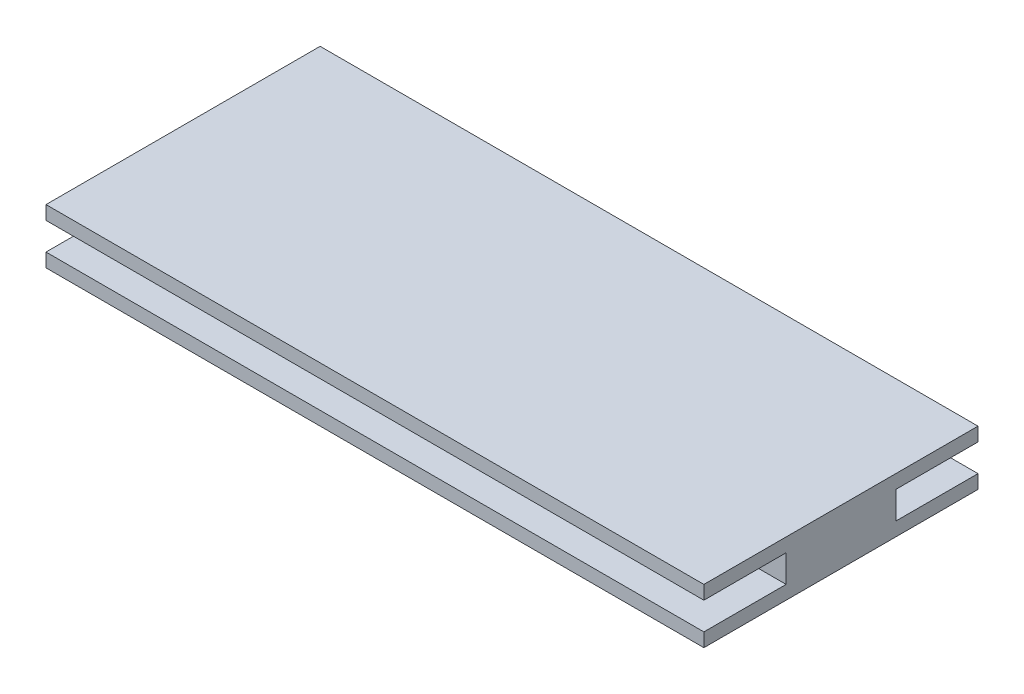
ISO-10303-21;
HEADER;
FILE_DESCRIPTION(('STEP AP214'),'2;1');
FILE_NAME('part.step','',(''),(''),'','','');
FILE_SCHEMA(('AUTOMOTIVE_DESIGN { 1 0 10303 214 1 1 1 1 }'));
ENDSEC;
DATA;
#1=APPLICATION_CONTEXT('core data for automotive mechanical design processes');
#2=APPLICATION_PROTOCOL_DEFINITION('international standard','automotive_design',2000,#1);
#3=PRODUCT_CONTEXT('',#1,'mechanical');
#4=PRODUCT('Part','Part','',(#3));
#5=PRODUCT_RELATED_PRODUCT_CATEGORY('part','',(#4));
#6=PRODUCT_DEFINITION_FORMATION('','',#4);
#7=PRODUCT_DEFINITION_CONTEXT('part definition',#1,'design');
#8=PRODUCT_DEFINITION('design','',#6,#7);
#9=PRODUCT_DEFINITION_SHAPE('','',#8);
#10=(LENGTH_UNIT() NAMED_UNIT(*) SI_UNIT(.MILLI.,.METRE.));
#11=(NAMED_UNIT(*) PLANE_ANGLE_UNIT() SI_UNIT($,.RADIAN.));
#12=(NAMED_UNIT(*) SI_UNIT($,.STERADIAN.) SOLID_ANGLE_UNIT());
#13=UNCERTAINTY_MEASURE_WITH_UNIT(LENGTH_MEASURE(1.E-05),#10,'distance_accuracy_value','');
#14=(GEOMETRIC_REPRESENTATION_CONTEXT(3) GLOBAL_UNCERTAINTY_ASSIGNED_CONTEXT((#13)) GLOBAL_UNIT_ASSIGNED_CONTEXT((#10,
#11,#12)) REPRESENTATION_CONTEXT('',''));
#15=CARTESIAN_POINT('',(0.,0.,0.));
#16=DIRECTION('',(0.,0.,1.));
#17=DIRECTION('',(1.,0.,0.));
#18=AXIS2_PLACEMENT_3D('',#15,#16,#17);
#19=CARTESIAN_POINT('',(76.2,1.5875,-15.875));
#20=DIRECTION('',(0.,0.,1.));
#21=DIRECTION('',(1.,0.,0.));
#22=AXIS2_PLACEMENT_3D('',#19,#20,#21);
#23=PLANE('',#22);
#24=DIRECTION('',(0.,1.,0.));
#25=VECTOR('',#24,1.);
#26=CARTESIAN_POINT('',(0.,1.5875,-15.875));
#27=LINE('',#26,#25);
#28=CARTESIAN_POINT('',(0.,1.5875,-15.875));
#29=VERTEX_POINT('',#28);
#30=CARTESIAN_POINT('',(0.,3.175,-15.875));
#31=VERTEX_POINT('',#30);
#32=EDGE_CURVE('E163',#29,#31,#27,.T.);
#33=ORIENTED_EDGE('',*,*,#32,.T.);
#34=DIRECTION('',(-1.,0.,0.));
#35=VECTOR('',#34,1.);
#36=CARTESIAN_POINT('',(76.2,3.175,-15.875));
#37=LINE('',#36,#35);
#38=CARTESIAN_POINT('',(76.2,3.175,-15.875));
#39=VERTEX_POINT('',#38);
#40=EDGE_CURVE('E11',#39,#31,#37,.T.);
#41=ORIENTED_EDGE('',*,*,#40,.F.);
#42=DIRECTION('',(0.,1.,0.));
#43=VECTOR('',#42,1.);
#44=CARTESIAN_POINT('',(76.2,1.5875,-15.875));
#45=LINE('',#44,#43);
#46=CARTESIAN_POINT('',(76.2,1.5875,-15.875));
#47=VERTEX_POINT('',#46);
#48=EDGE_CURVE('E185',#47,#39,#45,.T.);
#49=ORIENTED_EDGE('',*,*,#48,.F.);
#50=DIRECTION('',(-1.,0.,0.));
#51=VECTOR('',#50,1.);
#52=CARTESIAN_POINT('',(76.2,1.5875,-15.875));
#53=LINE('',#52,#51);
#54=EDGE_CURVE('E159',#47,#29,#53,.T.);
#55=ORIENTED_EDGE('',*,*,#54,.T.);
#56=EDGE_LOOP('',(#33,#41,#49,#55));
#57=FACE_BOUND('',#56,.T.);
#58=ADVANCED_FACE('F43',(#57),#23,.F.);
#59=CARTESIAN_POINT('',(76.2,3.175,15.875));
#60=DIRECTION('',(0.,-1.,0.));
#61=DIRECTION('',(0.,0.,-1.));
#62=AXIS2_PLACEMENT_3D('',#59,#60,#61);
#63=PLANE('',#62);
#64=DIRECTION('',(0.,0.,1.));
#65=VECTOR('',#64,1.);
#66=CARTESIAN_POINT('',(0.,3.175,15.875));
#67=LINE('',#66,#65);
#68=CARTESIAN_POINT('',(0.,3.175,15.875));
#69=VERTEX_POINT('',#68);
#70=EDGE_CURVE('E166',#31,#69,#67,.T.);
#71=ORIENTED_EDGE('',*,*,#70,.T.);
#72=DIRECTION('',(-1.,0.,0.));
#73=VECTOR('',#72,1.);
#74=CARTESIAN_POINT('',(76.2,3.175,15.875));
#75=LINE('',#74,#73);
#76=CARTESIAN_POINT('',(76.2,3.175,15.875));
#77=VERTEX_POINT('',#76);
#78=EDGE_CURVE('E51',#77,#69,#75,.T.);
#79=ORIENTED_EDGE('',*,*,#78,.F.);
#80=DIRECTION('',(0.,0.,1.));
#81=VECTOR('',#80,1.);
#82=CARTESIAN_POINT('',(76.2,3.175,15.875));
#83=LINE('',#82,#81);
#84=EDGE_CURVE('E114',#39,#77,#83,.T.);
#85=ORIENTED_EDGE('',*,*,#84,.F.);
#86=ORIENTED_EDGE('',*,*,#40,.T.);
#87=EDGE_LOOP('',(#71,#79,#85,#86));
#88=FACE_BOUND('',#87,.T.);
#89=ADVANCED_FACE('F263',(#88),#63,.F.);
#90=CARTESIAN_POINT('',(76.2,1.5875,15.875));
#91=DIRECTION('',(0.,0.,-1.));
#92=DIRECTION('',(-1.,0.,0.));
#93=AXIS2_PLACEMENT_3D('',#90,#91,#92);
#94=PLANE('',#93);
#95=DIRECTION('',(0.,-1.,0.));
#96=VECTOR('',#95,1.);
#97=CARTESIAN_POINT('',(0.,1.5875,15.875));
#98=LINE('',#97,#96);
#99=CARTESIAN_POINT('',(0.,1.5875,15.875));
#100=VERTEX_POINT('',#99);
#101=EDGE_CURVE('E168',#69,#100,#98,.T.);
#102=ORIENTED_EDGE('',*,*,#101,.T.);
#103=DIRECTION('',(-1.,0.,0.));
#104=VECTOR('',#103,1.);
#105=CARTESIAN_POINT('',(76.2,1.5875,15.875));
#106=LINE('',#105,#104);
#107=CARTESIAN_POINT('',(76.2,1.5875,15.875));
#108=VERTEX_POINT('',#107);
#109=EDGE_CURVE('E204',#108,#100,#106,.T.);
#110=ORIENTED_EDGE('',*,*,#109,.F.);
#111=DIRECTION('',(0.,-1.,0.));
#112=VECTOR('',#111,1.);
#113=CARTESIAN_POINT('',(76.2,1.5875,15.875));
#114=LINE('',#113,#112);
#115=EDGE_CURVE('E212',#77,#108,#114,.T.);
#116=ORIENTED_EDGE('',*,*,#115,.F.);
#117=ORIENTED_EDGE('',*,*,#78,.T.);
#118=EDGE_LOOP('',(#102,#110,#116,#117));
#119=FACE_BOUND('',#118,.T.);
#120=ADVANCED_FACE('F210',(#119),#94,.F.);
#121=CARTESIAN_POINT('',(76.2,1.5875,6.35));
#122=DIRECTION('',(0.,1.,0.));
#123=DIRECTION('',(0.,0.,1.));
#124=AXIS2_PLACEMENT_3D('',#121,#122,#123);
#125=PLANE('',#124);
#126=DIRECTION('',(0.,0.,-1.));
#127=VECTOR('',#126,1.);
#128=CARTESIAN_POINT('',(0.,1.5875,6.35));
#129=LINE('',#128,#127);
#130=CARTESIAN_POINT('',(0.,1.5875,6.35));
#131=VERTEX_POINT('',#130);
#132=EDGE_CURVE('E170',#100,#131,#129,.T.);
#133=ORIENTED_EDGE('',*,*,#132,.T.);
#134=DIRECTION('',(-1.,0.,0.));
#135=VECTOR('',#134,1.);
#136=CARTESIAN_POINT('',(76.2,1.5875,6.35));
#137=LINE('',#136,#135);
#138=CARTESIAN_POINT('',(76.2,1.5875,6.35));
#139=VERTEX_POINT('',#138);
#140=EDGE_CURVE('E201',#139,#131,#137,.T.);
#141=ORIENTED_EDGE('',*,*,#140,.F.);
#142=DIRECTION('',(0.,0.,-1.));
#143=VECTOR('',#142,1.);
#144=CARTESIAN_POINT('',(76.2,1.5875,6.35));
#145=LINE('',#144,#143);
#146=EDGE_CURVE('E230',#108,#139,#145,.T.);
#147=ORIENTED_EDGE('',*,*,#146,.F.);
#148=ORIENTED_EDGE('',*,*,#109,.T.);
#149=EDGE_LOOP('',(#133,#141,#147,#148));
#150=FACE_BOUND('',#149,.T.);
#151=ADVANCED_FACE('F221',(#150),#125,.F.);
#152=CARTESIAN_POINT('',(76.2,-1.5875,6.35));
#153=DIRECTION('',(0.,0.,-1.));
#154=DIRECTION('',(-1.,0.,0.));
#155=AXIS2_PLACEMENT_3D('',#152,#153,#154);
#156=PLANE('',#155);
#157=DIRECTION('',(0.,-1.,0.));
#158=VECTOR('',#157,1.);
#159=CARTESIAN_POINT('',(0.,-1.5875,6.35));
#160=LINE('',#159,#158);
#161=CARTESIAN_POINT('',(0.,-1.5875,6.35));
#162=VERTEX_POINT('',#161);
#163=EDGE_CURVE('E172',#131,#162,#160,.T.);
#164=ORIENTED_EDGE('',*,*,#163,.T.);
#165=DIRECTION('',(-1.,0.,0.));
#166=VECTOR('',#165,1.);
#167=CARTESIAN_POINT('',(76.2,-1.5875,6.35));
#168=LINE('',#167,#166);
#169=CARTESIAN_POINT('',(76.2,-1.5875,6.35));
#170=VERTEX_POINT('',#169);
#171=EDGE_CURVE('E198',#170,#162,#168,.T.);
#172=ORIENTED_EDGE('',*,*,#171,.F.);
#173=DIRECTION('',(0.,-1.,0.));
#174=VECTOR('',#173,1.);
#175=CARTESIAN_POINT('',(76.2,-1.5875,6.35));
#176=LINE('',#175,#174);
#177=EDGE_CURVE('E227',#139,#170,#176,.T.);
#178=ORIENTED_EDGE('',*,*,#177,.F.);
#179=ORIENTED_EDGE('',*,*,#140,.T.);
#180=EDGE_LOOP('',(#164,#172,#178,#179));
#181=FACE_BOUND('',#180,.T.);
#182=ADVANCED_FACE('F225',(#181),#156,.F.);
#183=CARTESIAN_POINT('',(76.2,-1.5875,6.35));
#184=DIRECTION('',(0.,-1.,0.));
#185=DIRECTION('',(0.,0.,-1.));
#186=AXIS2_PLACEMENT_3D('',#183,#184,#185);
#187=PLANE('',#186);
#188=DIRECTION('',(0.,0.,1.));
#189=VECTOR('',#188,1.);
#190=CARTESIAN_POINT('',(0.,-1.5875,6.35));
#191=LINE('',#190,#189);
#192=CARTESIAN_POINT('',(0.,-1.5875,15.875));
#193=VERTEX_POINT('',#192);
#194=EDGE_CURVE('E174',#162,#193,#191,.T.);
#195=ORIENTED_EDGE('',*,*,#194,.T.);
#196=DIRECTION('',(-1.,0.,0.));
#197=VECTOR('',#196,1.);
#198=CARTESIAN_POINT('',(76.2,-1.5875,15.875));
#199=LINE('',#198,#197);
#200=CARTESIAN_POINT('',(76.2,-1.5875,15.875));
#201=VERTEX_POINT('',#200);
#202=EDGE_CURVE('E195',#201,#193,#199,.T.);
#203=ORIENTED_EDGE('',*,*,#202,.F.);
#204=DIRECTION('',(0.,0.,1.));
#205=VECTOR('',#204,1.);
#206=CARTESIAN_POINT('',(76.2,-1.5875,6.35));
#207=LINE('',#206,#205);
#208=EDGE_CURVE('E229',#170,#201,#207,.T.);
#209=ORIENTED_EDGE('',*,*,#208,.F.);
#210=ORIENTED_EDGE('',*,*,#171,.T.);
#211=EDGE_LOOP('',(#195,#203,#209,#210));
#212=FACE_BOUND('',#211,.T.);
#213=ADVANCED_FACE('F276',(#212),#187,.F.);
#214=CARTESIAN_POINT('',(76.2,-3.175,15.875));
#215=DIRECTION('',(0.,0.,-1.));
#216=DIRECTION('',(-1.,0.,0.));
#217=AXIS2_PLACEMENT_3D('',#214,#215,#216);
#218=PLANE('',#217);
#219=DIRECTION('',(0.,-1.,0.));
#220=VECTOR('',#219,1.);
#221=CARTESIAN_POINT('',(0.,-3.175,15.875));
#222=LINE('',#221,#220);
#223=CARTESIAN_POINT('',(0.,-3.175,15.875));
#224=VERTEX_POINT('',#223);
#225=EDGE_CURVE('E176',#193,#224,#222,.T.);
#226=ORIENTED_EDGE('',*,*,#225,.T.);
#227=DIRECTION('',(-1.,0.,0.));
#228=VECTOR('',#227,1.);
#229=CARTESIAN_POINT('',(76.2,-3.175,15.875));
#230=LINE('',#229,#228);
#231=CARTESIAN_POINT('',(76.2,-3.175,15.875));
#232=VERTEX_POINT('',#231);
#233=EDGE_CURVE('E192',#232,#224,#230,.T.);
#234=ORIENTED_EDGE('',*,*,#233,.F.);
#235=DIRECTION('',(0.,-1.,0.));
#236=VECTOR('',#235,1.);
#237=CARTESIAN_POINT('',(76.2,-3.175,15.875));
#238=LINE('',#237,#236);
#239=EDGE_CURVE('E232',#201,#232,#238,.T.);
#240=ORIENTED_EDGE('',*,*,#239,.F.);
#241=ORIENTED_EDGE('',*,*,#202,.T.);
#242=EDGE_LOOP('',(#226,#234,#240,#241));
#243=FACE_BOUND('',#242,.T.);
#244=ADVANCED_FACE('F279',(#243),#218,.F.);
#245=CARTESIAN_POINT('',(76.2,-3.175,15.875));
#246=DIRECTION('',(0.,1.,0.));
#247=DIRECTION('',(0.,0.,1.));
#248=AXIS2_PLACEMENT_3D('',#245,#246,#247);
#249=PLANE('',#248);
#250=DIRECTION('',(0.,0.,-1.));
#251=VECTOR('',#250,1.);
#252=CARTESIAN_POINT('',(0.,-3.175,15.875));
#253=LINE('',#252,#251);
#254=CARTESIAN_POINT('',(0.,-3.175,-15.875));
#255=VERTEX_POINT('',#254);
#256=EDGE_CURVE('E178',#224,#255,#253,.T.);
#257=ORIENTED_EDGE('',*,*,#256,.T.);
#258=DIRECTION('',(-1.,0.,0.));
#259=VECTOR('',#258,1.);
#260=CARTESIAN_POINT('',(76.2,-3.175,-15.875));
#261=LINE('',#260,#259);
#262=CARTESIAN_POINT('',(76.2,-3.175,-15.875));
#263=VERTEX_POINT('',#262);
#264=EDGE_CURVE('E189',#263,#255,#261,.T.);
#265=ORIENTED_EDGE('',*,*,#264,.F.);
#266=DIRECTION('',(0.,0.,-1.));
#267=VECTOR('',#266,1.);
#268=CARTESIAN_POINT('',(76.2,-3.175,15.875));
#269=LINE('',#268,#267);
#270=EDGE_CURVE('E238',#232,#263,#269,.T.);
#271=ORIENTED_EDGE('',*,*,#270,.F.);
#272=ORIENTED_EDGE('',*,*,#233,.T.);
#273=EDGE_LOOP('',(#257,#265,#271,#272));
#274=FACE_BOUND('',#273,.T.);
#275=ADVANCED_FACE('F244',(#274),#249,.F.);
#276=CARTESIAN_POINT('',(76.2,-3.175,-15.875));
#277=DIRECTION('',(0.,0.,1.));
#278=DIRECTION('',(1.,0.,0.));
#279=AXIS2_PLACEMENT_3D('',#276,#277,#278);
#280=PLANE('',#279);
#281=DIRECTION('',(0.,1.,0.));
#282=VECTOR('',#281,1.);
#283=CARTESIAN_POINT('',(0.,-3.175,-15.875));
#284=LINE('',#283,#282);
#285=CARTESIAN_POINT('',(0.,-1.5875,-15.875));
#286=VERTEX_POINT('',#285);
#287=EDGE_CURVE('E180',#255,#286,#284,.T.);
#288=ORIENTED_EDGE('',*,*,#287,.T.);
#289=DIRECTION('',(-1.,0.,0.));
#290=VECTOR('',#289,1.);
#291=CARTESIAN_POINT('',(76.2,-1.5875,-15.875));
#292=LINE('',#291,#290);
#293=CARTESIAN_POINT('',(76.2,-1.5875,-15.875));
#294=VERTEX_POINT('',#293);
#295=EDGE_CURVE('E154',#294,#286,#292,.T.);
#296=ORIENTED_EDGE('',*,*,#295,.F.);
#297=DIRECTION('',(0.,1.,0.));
#298=VECTOR('',#297,1.);
#299=CARTESIAN_POINT('',(76.2,-3.175,-15.875));
#300=LINE('',#299,#298);
#301=EDGE_CURVE('E145',#263,#294,#300,.T.);
#302=ORIENTED_EDGE('',*,*,#301,.F.);
#303=ORIENTED_EDGE('',*,*,#264,.T.);
#304=EDGE_LOOP('',(#288,#296,#302,#303));
#305=FACE_BOUND('',#304,.T.);
#306=ADVANCED_FACE('F248',(#305),#280,.F.);
#307=CARTESIAN_POINT('',(76.2,-1.5875,-6.35));
#308=DIRECTION('',(0.,-1.,0.));
#309=DIRECTION('',(0.,0.,-1.));
#310=AXIS2_PLACEMENT_3D('',#307,#308,#309);
#311=PLANE('',#310);
#312=DIRECTION('',(0.,0.,1.));
#313=VECTOR('',#312,1.);
#314=CARTESIAN_POINT('',(0.,-1.5875,-6.35));
#315=LINE('',#314,#313);
#316=CARTESIAN_POINT('',(0.,-1.5875,-6.35));
#317=VERTEX_POINT('',#316);
#318=EDGE_CURVE('E153',#286,#317,#315,.T.);
#319=ORIENTED_EDGE('',*,*,#318,.T.);
#320=DIRECTION('',(-1.,0.,0.));
#321=VECTOR('',#320,1.);
#322=CARTESIAN_POINT('',(76.2,-1.5875,-6.35));
#323=LINE('',#322,#321);
#324=CARTESIAN_POINT('',(76.2,-1.5875,-6.35));
#325=VERTEX_POINT('',#324);
#326=EDGE_CURVE('E150',#325,#317,#323,.T.);
#327=ORIENTED_EDGE('',*,*,#326,.F.);
#328=DIRECTION('',(0.,0.,1.));
#329=VECTOR('',#328,1.);
#330=CARTESIAN_POINT('',(76.2,-1.5875,-6.35));
#331=LINE('',#330,#329);
#332=EDGE_CURVE('E139',#294,#325,#331,.T.);
#333=ORIENTED_EDGE('',*,*,#332,.F.);
#334=ORIENTED_EDGE('',*,*,#295,.T.);
#335=EDGE_LOOP('',(#319,#327,#333,#334));
#336=FACE_BOUND('',#335,.T.);
#337=ADVANCED_FACE('F151',(#336),#311,.F.);
#338=CARTESIAN_POINT('',(76.2,-1.5875,-6.35));
#339=DIRECTION('',(0.,0.,1.));
#340=DIRECTION('',(1.,0.,0.));
#341=AXIS2_PLACEMENT_3D('',#338,#339,#340);
#342=PLANE('',#341);
#343=DIRECTION('',(0.,1.,0.));
#344=VECTOR('',#343,1.);
#345=CARTESIAN_POINT('',(0.,-1.5875,-6.35));
#346=LINE('',#345,#344);
#347=CARTESIAN_POINT('',(0.,1.5875,-6.35));
#348=VERTEX_POINT('',#347);
#349=EDGE_CURVE('E100',#317,#348,#346,.T.);
#350=ORIENTED_EDGE('',*,*,#349,.T.);
#351=DIRECTION('',(-1.,0.,0.));
#352=VECTOR('',#351,1.);
#353=CARTESIAN_POINT('',(76.2,1.5875,-6.35));
#354=LINE('',#353,#352);
#355=CARTESIAN_POINT('',(76.2,1.5875,-6.35));
#356=VERTEX_POINT('',#355);
#357=EDGE_CURVE('E155',#356,#348,#354,.T.);
#358=ORIENTED_EDGE('',*,*,#357,.F.);
#359=DIRECTION('',(0.,1.,0.));
#360=VECTOR('',#359,1.);
#361=CARTESIAN_POINT('',(76.2,-1.5875,-6.35));
#362=LINE('',#361,#360);
#363=EDGE_CURVE('E143',#325,#356,#362,.T.);
#364=ORIENTED_EDGE('',*,*,#363,.F.);
#365=ORIENTED_EDGE('',*,*,#326,.T.);
#366=EDGE_LOOP('',(#350,#358,#364,#365));
#367=FACE_BOUND('',#366,.T.);
#368=ADVANCED_FACE('F157',(#367),#342,.F.);
#369=CARTESIAN_POINT('',(76.2,1.5875,-6.35));
#370=DIRECTION('',(0.,1.,0.));
#371=DIRECTION('',(0.,0.,1.));
#372=AXIS2_PLACEMENT_3D('',#369,#370,#371);
#373=PLANE('',#372);
#374=DIRECTION('',(0.,0.,-1.));
#375=VECTOR('',#374,1.);
#376=CARTESIAN_POINT('',(0.,1.5875,-6.35));
#377=LINE('',#376,#375);
#378=EDGE_CURVE('E106',#348,#29,#377,.T.);
#379=ORIENTED_EDGE('',*,*,#378,.T.);
#380=ORIENTED_EDGE('',*,*,#54,.F.);
#381=DIRECTION('',(0.,0.,-1.));
#382=VECTOR('',#381,1.);
#383=CARTESIAN_POINT('',(76.2,1.5875,-6.35));
#384=LINE('',#383,#382);
#385=EDGE_CURVE('E59',#356,#47,#384,.T.);
#386=ORIENTED_EDGE('',*,*,#385,.F.);
#387=ORIENTED_EDGE('',*,*,#357,.T.);
#388=EDGE_LOOP('',(#379,#380,#386,#387));
#389=FACE_BOUND('',#388,.T.);
#390=ADVANCED_FACE('F252',(#389),#373,.F.);
#391=CARTESIAN_POINT('',(76.2,0.,0.));
#392=DIRECTION('',(-1.,0.,0.));
#393=DIRECTION('',(0.,0.,1.));
#394=AXIS2_PLACEMENT_3D('',#391,#392,#393);
#395=PLANE('',#394);
#396=ORIENTED_EDGE('',*,*,#48,.T.);
#397=ORIENTED_EDGE('',*,*,#84,.T.);
#398=ORIENTED_EDGE('',*,*,#115,.T.);
#399=ORIENTED_EDGE('',*,*,#146,.T.);
#400=ORIENTED_EDGE('',*,*,#177,.T.);
#401=ORIENTED_EDGE('',*,*,#208,.T.);
#402=ORIENTED_EDGE('',*,*,#239,.T.);
#403=ORIENTED_EDGE('',*,*,#270,.T.);
#404=ORIENTED_EDGE('',*,*,#301,.T.);
#405=ORIENTED_EDGE('',*,*,#332,.T.);
#406=ORIENTED_EDGE('',*,*,#363,.T.);
#407=ORIENTED_EDGE('',*,*,#385,.T.);
#408=EDGE_LOOP('',(#396,#397,#398,#399,#400,#401,#402,#403,#404,#405,#406,#407));
#409=FACE_BOUND('',#408,.T.);
#410=ADVANCED_FACE('F141',(#409),#395,.F.);
#411=CARTESIAN_POINT('',(0.,0.,0.));
#412=DIRECTION('',(-1.,0.,0.));
#413=DIRECTION('',(0.,0.,1.));
#414=AXIS2_PLACEMENT_3D('',#411,#412,#413);
#415=PLANE('',#414);
#416=ORIENTED_EDGE('',*,*,#32,.F.);
#417=ORIENTED_EDGE('',*,*,#378,.F.);
#418=ORIENTED_EDGE('',*,*,#349,.F.);
#419=ORIENTED_EDGE('',*,*,#318,.F.);
#420=ORIENTED_EDGE('',*,*,#287,.F.);
#421=ORIENTED_EDGE('',*,*,#256,.F.);
#422=ORIENTED_EDGE('',*,*,#225,.F.);
#423=ORIENTED_EDGE('',*,*,#194,.F.);
#424=ORIENTED_EDGE('',*,*,#163,.F.);
#425=ORIENTED_EDGE('',*,*,#132,.F.);
#426=ORIENTED_EDGE('',*,*,#101,.F.);
#427=ORIENTED_EDGE('',*,*,#70,.F.);
#428=EDGE_LOOP('',(#416,#417,#418,#419,#420,#421,#422,#423,#424,#425,#426,#427));
#429=FACE_BOUND('',#428,.T.);
#430=ADVANCED_FACE('F216',(#429),#415,.T.);
#431=CLOSED_SHELL('',(#58,#89,#120,#151,#182,#213,#244,#275,#306,#337,#368,#390,#410,#430));
#432=MANIFOLD_SOLID_BREP('B2',#431);
#433=ADVANCED_BREP_SHAPE_REPRESENTATION('',(#18,#432),#14);
#434=SHAPE_DEFINITION_REPRESENTATION(#9,#433);
ENDSEC;
END-ISO-10303-21;
